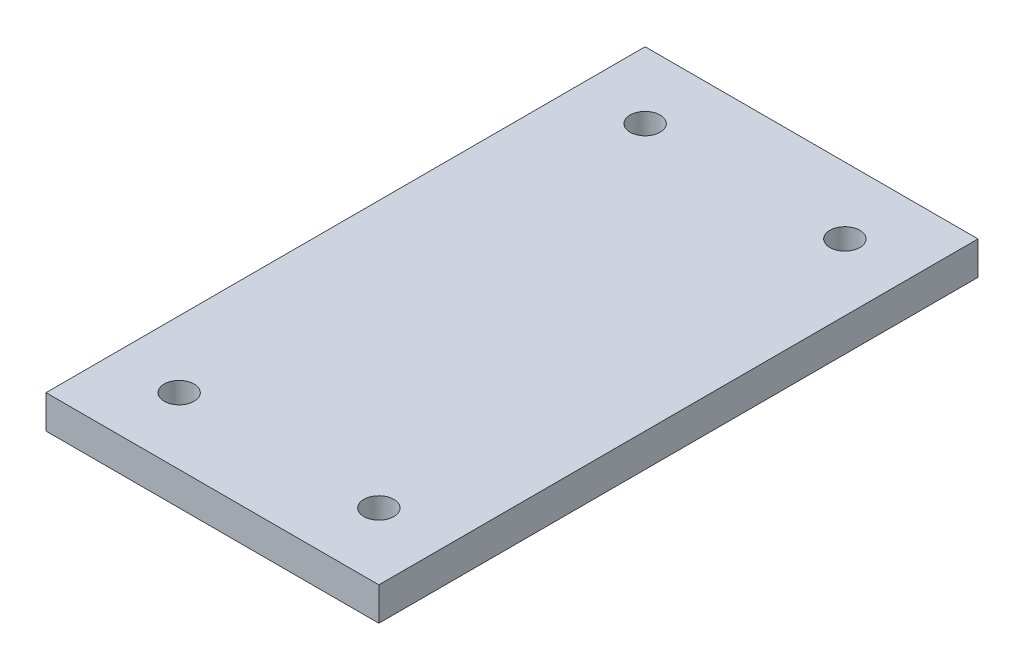
ISO-10303-21;
HEADER;
FILE_DESCRIPTION(('STEP AP214'),'2;1');
FILE_NAME('part.step','',(''),(''),'','','');
FILE_SCHEMA(('AUTOMOTIVE_DESIGN { 1 0 10303 214 1 1 1 1 }'));
ENDSEC;
DATA;
#1=APPLICATION_CONTEXT('core data for automotive mechanical design processes');
#2=APPLICATION_PROTOCOL_DEFINITION('international standard','automotive_design',2000,#1);
#3=PRODUCT_CONTEXT('',#1,'mechanical');
#4=PRODUCT('Part','Part','',(#3));
#5=PRODUCT_RELATED_PRODUCT_CATEGORY('part','',(#4));
#6=PRODUCT_DEFINITION_FORMATION('','',#4);
#7=PRODUCT_DEFINITION_CONTEXT('part definition',#1,'design');
#8=PRODUCT_DEFINITION('design','',#6,#7);
#9=PRODUCT_DEFINITION_SHAPE('','',#8);
#10=(LENGTH_UNIT() NAMED_UNIT(*) SI_UNIT(.MILLI.,.METRE.));
#11=(NAMED_UNIT(*) PLANE_ANGLE_UNIT() SI_UNIT($,.RADIAN.));
#12=(NAMED_UNIT(*) SI_UNIT($,.STERADIAN.) SOLID_ANGLE_UNIT());
#13=UNCERTAINTY_MEASURE_WITH_UNIT(LENGTH_MEASURE(1.E-05),#10,'distance_accuracy_value','');
#14=(GEOMETRIC_REPRESENTATION_CONTEXT(3) GLOBAL_UNCERTAINTY_ASSIGNED_CONTEXT((#13)) GLOBAL_UNIT_ASSIGNED_CONTEXT((#10,
#11,#12)) REPRESENTATION_CONTEXT('',''));
#15=CARTESIAN_POINT('',(0.,0.,0.));
#16=DIRECTION('',(0.,0.,1.));
#17=DIRECTION('',(1.,0.,0.));
#18=AXIS2_PLACEMENT_3D('',#15,#16,#17);
#19=CARTESIAN_POINT('',(0.,2.5,0.));
#20=DIRECTION('',(0.,1.,0.));
#21=DIRECTION('',(0.,0.,1.));
#22=AXIS2_PLACEMENT_3D('',#19,#20,#21);
#23=PLANE('',#22);
#24=CARTESIAN_POINT('',(-15.,2.5,35.));
#25=DIRECTION('',(0.,1.,0.));
#26=DIRECTION('',(0.,0.,1.));
#27=AXIS2_PLACEMENT_3D('',#24,#25,#26);
#28=CIRCLE('',#27,2.25);
#29=CARTESIAN_POINT('',(-15.,2.5,37.25));
#30=VERTEX_POINT('',#29);
#31=EDGE_CURVE('E124',#30,#30,#28,.T.);
#32=ORIENTED_EDGE('',*,*,#31,.F.);
#33=EDGE_LOOP('',(#32));
#34=FACE_BOUND('',#33,.T.);
#35=CARTESIAN_POINT('',(15.,2.5,-35.));
#36=DIRECTION('',(0.,1.,0.));
#37=DIRECTION('',(0.,0.,1.));
#38=AXIS2_PLACEMENT_3D('',#35,#36,#37);
#39=CIRCLE('',#38,2.25);
#40=CARTESIAN_POINT('',(15.,2.5,-32.75));
#41=VERTEX_POINT('',#40);
#42=EDGE_CURVE('E103',#41,#41,#39,.T.);
#43=ORIENTED_EDGE('',*,*,#42,.F.);
#44=EDGE_LOOP('',(#43));
#45=FACE_BOUND('',#44,.T.);
#46=DIRECTION('',(0.,0.,1.));
#47=VECTOR('',#46,1.);
#48=CARTESIAN_POINT('',(-25.,2.5,45.));
#49=LINE('',#48,#47);
#50=CARTESIAN_POINT('',(-25.,2.5,-45.));
#51=VERTEX_POINT('',#50);
#52=CARTESIAN_POINT('',(-25.,2.5,45.));
#53=VERTEX_POINT('',#52);
#54=EDGE_CURVE('E88',#51,#53,#49,.T.);
#55=ORIENTED_EDGE('',*,*,#54,.T.);
#56=DIRECTION('',(1.,0.,0.));
#57=VECTOR('',#56,1.);
#58=CARTESIAN_POINT('',(25.,2.5,45.));
#59=LINE('',#58,#57);
#60=CARTESIAN_POINT('',(25.,2.5,45.));
#61=VERTEX_POINT('',#60);
#62=EDGE_CURVE('E83',#53,#61,#59,.T.);
#63=ORIENTED_EDGE('',*,*,#62,.T.);
#64=DIRECTION('',(0.,0.,-1.));
#65=VECTOR('',#64,1.);
#66=CARTESIAN_POINT('',(25.,2.5,45.));
#67=LINE('',#66,#65);
#68=CARTESIAN_POINT('',(25.,2.5,-45.));
#69=VERTEX_POINT('',#68);
#70=EDGE_CURVE('E86',#61,#69,#67,.T.);
#71=ORIENTED_EDGE('',*,*,#70,.T.);
#72=DIRECTION('',(-1.,0.,0.));
#73=VECTOR('',#72,1.);
#74=CARTESIAN_POINT('',(25.,2.5,-45.));
#75=LINE('',#74,#73);
#76=EDGE_CURVE('E53',#69,#51,#75,.T.);
#77=ORIENTED_EDGE('',*,*,#76,.T.);
#78=EDGE_LOOP('',(#55,#63,#71,#77));
#79=FACE_BOUND('',#78,.T.);
#80=CARTESIAN_POINT('',(15.,2.5,35.));
#81=DIRECTION('',(0.,1.,0.));
#82=DIRECTION('',(0.,0.,-1.));
#83=AXIS2_PLACEMENT_3D('',#80,#81,#82);
#84=CIRCLE('',#83,2.25);
#85=CARTESIAN_POINT('',(15.,2.5,32.75));
#86=VERTEX_POINT('',#85);
#87=EDGE_CURVE('E118',#86,#86,#84,.T.);
#88=ORIENTED_EDGE('',*,*,#87,.F.);
#89=EDGE_LOOP('',(#88));
#90=FACE_BOUND('',#89,.T.);
#91=CARTESIAN_POINT('',(-15.,2.5,-35.));
#92=DIRECTION('',(0.,1.,0.));
#93=DIRECTION('',(0.,0.,-1.));
#94=AXIS2_PLACEMENT_3D('',#91,#92,#93);
#95=CIRCLE('',#94,2.25);
#96=CARTESIAN_POINT('',(-15.,2.5,-37.25));
#97=VERTEX_POINT('',#96);
#98=EDGE_CURVE('E130',#97,#97,#95,.T.);
#99=ORIENTED_EDGE('',*,*,#98,.F.);
#100=EDGE_LOOP('',(#99));
#101=FACE_BOUND('',#100,.T.);
#102=ADVANCED_FACE('F36',(#34,#45,#79,#90,#101),#23,.T.);
#103=CARTESIAN_POINT('',(0.,-2.5,0.));
#104=DIRECTION('',(0.,1.,0.));
#105=DIRECTION('',(0.,0.,1.));
#106=AXIS2_PLACEMENT_3D('',#103,#104,#105);
#107=PLANE('',#106);
#108=DIRECTION('',(0.,0.,1.));
#109=VECTOR('',#108,1.);
#110=CARTESIAN_POINT('',(-25.,-2.5,45.));
#111=LINE('',#110,#109);
#112=CARTESIAN_POINT('',(-25.,-2.5,-45.));
#113=VERTEX_POINT('',#112);
#114=CARTESIAN_POINT('',(-25.,-2.5,45.));
#115=VERTEX_POINT('',#114);
#116=EDGE_CURVE('E100',#113,#115,#111,.T.);
#117=ORIENTED_EDGE('',*,*,#116,.F.);
#118=DIRECTION('',(-1.,0.,0.));
#119=VECTOR('',#118,1.);
#120=CARTESIAN_POINT('',(25.,-2.5,-45.));
#121=LINE('',#120,#119);
#122=CARTESIAN_POINT('',(25.,-2.5,-45.));
#123=VERTEX_POINT('',#122);
#124=EDGE_CURVE('E76',#123,#113,#121,.T.);
#125=ORIENTED_EDGE('',*,*,#124,.F.);
#126=DIRECTION('',(0.,0.,-1.));
#127=VECTOR('',#126,1.);
#128=CARTESIAN_POINT('',(25.,-2.5,45.));
#129=LINE('',#128,#127);
#130=CARTESIAN_POINT('',(25.,-2.5,45.));
#131=VERTEX_POINT('',#130);
#132=EDGE_CURVE('E70',#131,#123,#129,.T.);
#133=ORIENTED_EDGE('',*,*,#132,.F.);
#134=DIRECTION('',(1.,0.,0.));
#135=VECTOR('',#134,1.);
#136=CARTESIAN_POINT('',(25.,-2.5,45.));
#137=LINE('',#136,#135);
#138=EDGE_CURVE('E92',#115,#131,#137,.T.);
#139=ORIENTED_EDGE('',*,*,#138,.F.);
#140=EDGE_LOOP('',(#117,#125,#133,#139));
#141=FACE_BOUND('',#140,.T.);
#142=CARTESIAN_POINT('',(15.,-2.5,-35.));
#143=DIRECTION('',(0.,1.,0.));
#144=DIRECTION('',(0.,0.,1.));
#145=AXIS2_PLACEMENT_3D('',#142,#143,#144);
#146=CIRCLE('',#145,2.25);
#147=CARTESIAN_POINT('',(15.,-2.5,-32.75));
#148=VERTEX_POINT('',#147);
#149=EDGE_CURVE('E115',#148,#148,#146,.T.);
#150=ORIENTED_EDGE('',*,*,#149,.T.);
#151=EDGE_LOOP('',(#150));
#152=FACE_BOUND('',#151,.T.);
#153=CARTESIAN_POINT('',(15.,-2.5,35.));
#154=DIRECTION('',(0.,1.,0.));
#155=DIRECTION('',(0.,0.,-1.));
#156=AXIS2_PLACEMENT_3D('',#153,#154,#155);
#157=CIRCLE('',#156,2.25);
#158=CARTESIAN_POINT('',(15.,-2.5,32.75));
#159=VERTEX_POINT('',#158);
#160=EDGE_CURVE('E121',#159,#159,#157,.T.);
#161=ORIENTED_EDGE('',*,*,#160,.T.);
#162=EDGE_LOOP('',(#161));
#163=FACE_BOUND('',#162,.T.);
#164=CARTESIAN_POINT('',(-15.,-2.5,35.));
#165=DIRECTION('',(0.,1.,0.));
#166=DIRECTION('',(0.,0.,1.));
#167=AXIS2_PLACEMENT_3D('',#164,#165,#166);
#168=CIRCLE('',#167,2.25);
#169=CARTESIAN_POINT('',(-15.,-2.5,37.25));
#170=VERTEX_POINT('',#169);
#171=EDGE_CURVE('E127',#170,#170,#168,.T.);
#172=ORIENTED_EDGE('',*,*,#171,.T.);
#173=EDGE_LOOP('',(#172));
#174=FACE_BOUND('',#173,.T.);
#175=CARTESIAN_POINT('',(-15.,-2.5,-35.));
#176=DIRECTION('',(0.,1.,0.));
#177=DIRECTION('',(0.,0.,-1.));
#178=AXIS2_PLACEMENT_3D('',#175,#176,#177);
#179=CIRCLE('',#178,2.25);
#180=CARTESIAN_POINT('',(-15.,-2.5,-37.25));
#181=VERTEX_POINT('',#180);
#182=EDGE_CURVE('E133',#181,#181,#179,.T.);
#183=ORIENTED_EDGE('',*,*,#182,.T.);
#184=EDGE_LOOP('',(#183));
#185=FACE_BOUND('',#184,.T.);
#186=ADVANCED_FACE('F111',(#141,#152,#163,#174,#185),#107,.F.);
#187=CARTESIAN_POINT('',(-25.,2.5,45.));
#188=DIRECTION('',(1.,0.,0.));
#189=DIRECTION('',(0.,0.,-1.));
#190=AXIS2_PLACEMENT_3D('',#187,#188,#189);
#191=PLANE('',#190);
#192=ORIENTED_EDGE('',*,*,#116,.T.);
#193=DIRECTION('',(0.,-1.,0.));
#194=VECTOR('',#193,1.);
#195=CARTESIAN_POINT('',(-25.,2.5,45.));
#196=LINE('',#195,#194);
#197=EDGE_CURVE('E11',#53,#115,#196,.T.);
#198=ORIENTED_EDGE('',*,*,#197,.F.);
#199=ORIENTED_EDGE('',*,*,#54,.F.);
#200=DIRECTION('',(0.,-1.,0.));
#201=VECTOR('',#200,1.);
#202=CARTESIAN_POINT('',(-25.,2.5,-45.));
#203=LINE('',#202,#201);
#204=EDGE_CURVE('E96',#51,#113,#203,.T.);
#205=ORIENTED_EDGE('',*,*,#204,.T.);
#206=EDGE_LOOP('',(#192,#198,#199,#205));
#207=FACE_BOUND('',#206,.T.);
#208=ADVANCED_FACE('F38',(#207),#191,.F.);
#209=CARTESIAN_POINT('',(25.,2.5,45.));
#210=DIRECTION('',(0.,0.,-1.));
#211=DIRECTION('',(-1.,0.,0.));
#212=AXIS2_PLACEMENT_3D('',#209,#210,#211);
#213=PLANE('',#212);
#214=ORIENTED_EDGE('',*,*,#138,.T.);
#215=DIRECTION('',(0.,-1.,0.));
#216=VECTOR('',#215,1.);
#217=CARTESIAN_POINT('',(25.,2.5,45.));
#218=LINE('',#217,#216);
#219=EDGE_CURVE('E45',#61,#131,#218,.T.);
#220=ORIENTED_EDGE('',*,*,#219,.F.);
#221=ORIENTED_EDGE('',*,*,#62,.F.);
#222=ORIENTED_EDGE('',*,*,#197,.T.);
#223=EDGE_LOOP('',(#214,#220,#221,#222));
#224=FACE_BOUND('',#223,.T.);
#225=ADVANCED_FACE('F91',(#224),#213,.F.);
#226=CARTESIAN_POINT('',(25.,2.5,45.));
#227=DIRECTION('',(-1.,0.,0.));
#228=DIRECTION('',(0.,0.,1.));
#229=AXIS2_PLACEMENT_3D('',#226,#227,#228);
#230=PLANE('',#229);
#231=ORIENTED_EDGE('',*,*,#132,.T.);
#232=DIRECTION('',(0.,-1.,0.));
#233=VECTOR('',#232,1.);
#234=CARTESIAN_POINT('',(25.,2.5,-45.));
#235=LINE('',#234,#233);
#236=EDGE_CURVE('E93',#69,#123,#235,.T.);
#237=ORIENTED_EDGE('',*,*,#236,.F.);
#238=ORIENTED_EDGE('',*,*,#70,.F.);
#239=ORIENTED_EDGE('',*,*,#219,.T.);
#240=EDGE_LOOP('',(#231,#237,#238,#239));
#241=FACE_BOUND('',#240,.T.);
#242=ADVANCED_FACE('F94',(#241),#230,.F.);
#243=CARTESIAN_POINT('',(25.,2.5,-45.));
#244=DIRECTION('',(0.,0.,1.));
#245=DIRECTION('',(1.,0.,0.));
#246=AXIS2_PLACEMENT_3D('',#243,#244,#245);
#247=PLANE('',#246);
#248=ORIENTED_EDGE('',*,*,#124,.T.);
#249=ORIENTED_EDGE('',*,*,#204,.F.);
#250=ORIENTED_EDGE('',*,*,#76,.F.);
#251=ORIENTED_EDGE('',*,*,#236,.T.);
#252=EDGE_LOOP('',(#248,#249,#250,#251));
#253=FACE_BOUND('',#252,.T.);
#254=ADVANCED_FACE('F108',(#253),#247,.F.);
#255=CARTESIAN_POINT('',(15.,2.5,-35.));
#256=DIRECTION('',(0.,-1.,0.));
#257=DIRECTION('',(0.,0.,-1.));
#258=AXIS2_PLACEMENT_3D('',#255,#256,#257);
#259=CYLINDRICAL_SURFACE('',#258,2.25);
#260=ORIENTED_EDGE('',*,*,#42,.T.);
#261=EDGE_LOOP('',(#260));
#262=FACE_BOUND('',#261,.T.);
#263=ORIENTED_EDGE('',*,*,#149,.F.);
#264=EDGE_LOOP('',(#263));
#265=FACE_BOUND('',#264,.T.);
#266=ADVANCED_FACE('F152',(#262,#265),#259,.F.);
#267=CARTESIAN_POINT('',(15.,2.5,35.));
#268=DIRECTION('',(0.,-1.,0.));
#269=DIRECTION('',(0.,0.,-1.));
#270=AXIS2_PLACEMENT_3D('',#267,#268,#269);
#271=CYLINDRICAL_SURFACE('',#270,2.25);
#272=ORIENTED_EDGE('',*,*,#87,.T.);
#273=EDGE_LOOP('',(#272));
#274=FACE_BOUND('',#273,.T.);
#275=ORIENTED_EDGE('',*,*,#160,.F.);
#276=EDGE_LOOP('',(#275));
#277=FACE_BOUND('',#276,.T.);
#278=ADVANCED_FACE('F198',(#274,#277),#271,.F.);
#279=CARTESIAN_POINT('',(-15.,2.5,35.));
#280=DIRECTION('',(0.,-1.,0.));
#281=DIRECTION('',(0.,0.,-1.));
#282=AXIS2_PLACEMENT_3D('',#279,#280,#281);
#283=CYLINDRICAL_SURFACE('',#282,2.25);
#284=ORIENTED_EDGE('',*,*,#31,.T.);
#285=EDGE_LOOP('',(#284));
#286=FACE_BOUND('',#285,.T.);
#287=ORIENTED_EDGE('',*,*,#171,.F.);
#288=EDGE_LOOP('',(#287));
#289=FACE_BOUND('',#288,.T.);
#290=ADVANCED_FACE('F206',(#286,#289),#283,.F.);
#291=CARTESIAN_POINT('',(-15.,2.5,-35.));
#292=DIRECTION('',(0.,-1.,0.));
#293=DIRECTION('',(0.,0.,-1.));
#294=AXIS2_PLACEMENT_3D('',#291,#292,#293);
#295=CYLINDRICAL_SURFACE('',#294,2.25);
#296=ORIENTED_EDGE('',*,*,#98,.T.);
#297=EDGE_LOOP('',(#296));
#298=FACE_BOUND('',#297,.T.);
#299=ORIENTED_EDGE('',*,*,#182,.F.);
#300=EDGE_LOOP('',(#299));
#301=FACE_BOUND('',#300,.T.);
#302=ADVANCED_FACE('F139',(#298,#301),#295,.F.);
#303=CLOSED_SHELL('',(#102,#186,#208,#225,#242,#254,#266,#278,#290,#302));
#304=MANIFOLD_SOLID_BREP('B2',#303);
#305=ADVANCED_BREP_SHAPE_REPRESENTATION('',(#18,#304),#14);
#306=SHAPE_DEFINITION_REPRESENTATION(#9,#305);
ENDSEC;
END-ISO-10303-21;
